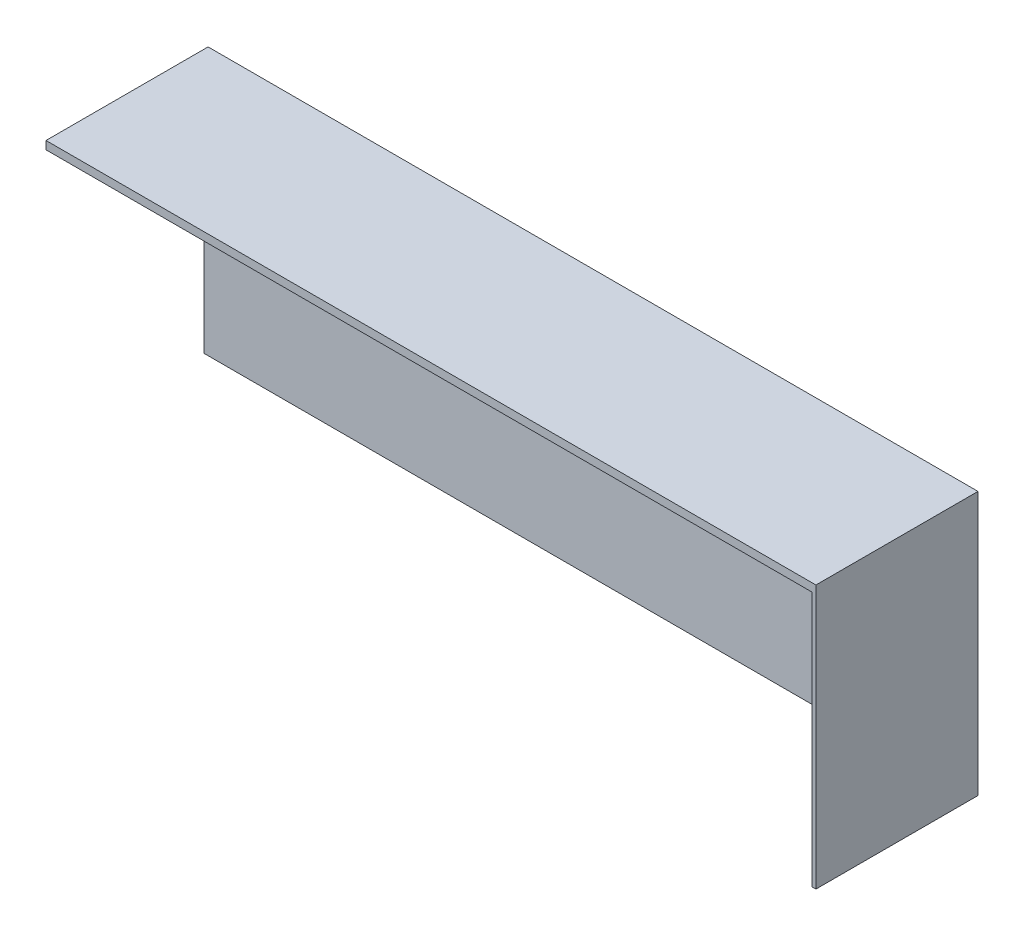
ISO-10303-21;
HEADER;
FILE_DESCRIPTION(('STEP AP214'),'2;1');
FILE_NAME('part.step','',(''),(''),'','','');
FILE_SCHEMA(('AUTOMOTIVE_DESIGN { 1 0 10303 214 1 1 1 1 }'));
ENDSEC;
DATA;
#1=APPLICATION_CONTEXT('core data for automotive mechanical design processes');
#2=APPLICATION_PROTOCOL_DEFINITION('international standard','automotive_design',2000,#1);
#3=PRODUCT_CONTEXT('',#1,'mechanical');
#4=PRODUCT('Part','Part','',(#3));
#5=PRODUCT_RELATED_PRODUCT_CATEGORY('part','',(#4));
#6=PRODUCT_DEFINITION_FORMATION('','',#4);
#7=PRODUCT_DEFINITION_CONTEXT('part definition',#1,'design');
#8=PRODUCT_DEFINITION('design','',#6,#7);
#9=PRODUCT_DEFINITION_SHAPE('','',#8);
#10=(LENGTH_UNIT() NAMED_UNIT(*) SI_UNIT(.MILLI.,.METRE.));
#11=(NAMED_UNIT(*) PLANE_ANGLE_UNIT() SI_UNIT($,.RADIAN.));
#12=(NAMED_UNIT(*) SI_UNIT($,.STERADIAN.) SOLID_ANGLE_UNIT());
#13=UNCERTAINTY_MEASURE_WITH_UNIT(LENGTH_MEASURE(1.E-05),#10,'distance_accuracy_value','');
#14=(GEOMETRIC_REPRESENTATION_CONTEXT(3) GLOBAL_UNCERTAINTY_ASSIGNED_CONTEXT((#13)) GLOBAL_UNIT_ASSIGNED_CONTEXT((#10,
#11,#12)) REPRESENTATION_CONTEXT('',''));
#15=CARTESIAN_POINT('',(0.,0.,0.));
#16=DIRECTION('',(0.,0.,1.));
#17=DIRECTION('',(1.,0.,0.));
#18=AXIS2_PLACEMENT_3D('',#15,#16,#17);
#19=CARTESIAN_POINT('',(-1900.,2591.64878389476,0.));
#20=DIRECTION('',(1.,0.,0.));
#21=DIRECTION('',(0.,0.,-1.));
#22=AXIS2_PLACEMENT_3D('',#19,#20,#21);
#23=PLANE('',#22);
#24=DIRECTION('',(0.,-1.,0.));
#25=VECTOR('',#24,1.);
#26=CARTESIAN_POINT('',(-1900.,2591.64878389476,10.));
#27=LINE('',#26,#25);
#28=CARTESIAN_POINT('',(-1900.,630.,10.));
#29=VERTEX_POINT('',#28);
#30=CARTESIAN_POINT('',(-1900.,0.,10.));
#31=VERTEX_POINT('',#30);
#32=EDGE_CURVE('E77',#29,#31,#27,.T.);
#33=ORIENTED_EDGE('',*,*,#32,.F.);
#34=DIRECTION('',(0.,0.,1.));
#35=VECTOR('',#34,1.);
#36=CARTESIAN_POINT('',(-1900.,630.,0.));
#37=LINE('',#36,#35);
#38=CARTESIAN_POINT('',(-1900.,630.,400.));
#39=VERTEX_POINT('',#38);
#40=EDGE_CURVE('E147',#29,#39,#37,.T.);
#41=ORIENTED_EDGE('',*,*,#40,.T.);
#42=DIRECTION('',(0.,1.,0.));
#43=VECTOR('',#42,1.);
#44=CARTESIAN_POINT('',(-1900.,630.,400.));
#45=LINE('',#44,#43);
#46=CARTESIAN_POINT('',(-1900.,650.,400.));
#47=VERTEX_POINT('',#46);
#48=EDGE_CURVE('E140',#39,#47,#45,.T.);
#49=ORIENTED_EDGE('',*,*,#48,.T.);
#50=DIRECTION('',(0.,0.,1.));
#51=VECTOR('',#50,1.);
#52=CARTESIAN_POINT('',(-1900.,650.,0.));
#53=LINE('',#52,#51);
#54=CARTESIAN_POINT('',(-1900.,650.,0.));
#55=VERTEX_POINT('',#54);
#56=EDGE_CURVE('E113',#55,#47,#53,.T.);
#57=ORIENTED_EDGE('',*,*,#56,.F.);
#58=DIRECTION('',(0.,-1.,0.));
#59=VECTOR('',#58,1.);
#60=CARTESIAN_POINT('',(-1900.,2591.64878389476,0.));
#61=LINE('',#60,#59);
#62=CARTESIAN_POINT('',(-1900.,0.,0.));
#63=VERTEX_POINT('',#62);
#64=EDGE_CURVE('E37',#55,#63,#61,.T.);
#65=ORIENTED_EDGE('',*,*,#64,.T.);
#66=DIRECTION('',(0.,0.,1.));
#67=VECTOR('',#66,1.);
#68=CARTESIAN_POINT('',(-1900.,0.,0.));
#69=LINE('',#68,#67);
#70=EDGE_CURVE('E124',#63,#31,#69,.T.);
#71=ORIENTED_EDGE('',*,*,#70,.T.);
#72=EDGE_LOOP('',(#33,#41,#49,#57,#65,#71));
#73=FACE_BOUND('',#72,.T.);
#74=ADVANCED_FACE('F33',(#73),#23,.F.);
#75=CARTESIAN_POINT('',(-1900.,2591.64878389476,10.));
#76=DIRECTION('',(0.,0.,-1.));
#77=DIRECTION('',(-1.,0.,0.));
#78=AXIS2_PLACEMENT_3D('',#75,#76,#77);
#79=PLANE('',#78);
#80=DIRECTION('',(0.,-1.,0.));
#81=VECTOR('',#80,1.);
#82=CARTESIAN_POINT('',(-10.,2591.64878389476,10.));
#83=LINE('',#82,#81);
#84=CARTESIAN_POINT('',(-10.,630.,10.));
#85=VERTEX_POINT('',#84);
#86=CARTESIAN_POINT('',(-10.,0.,10.));
#87=VERTEX_POINT('',#86);
#88=EDGE_CURVE('E125',#85,#87,#83,.T.);
#89=ORIENTED_EDGE('',*,*,#88,.F.);
#90=DIRECTION('',(-1.,0.,0.));
#91=VECTOR('',#90,1.);
#92=CARTESIAN_POINT('',(-1900.,630.,10.));
#93=LINE('',#92,#91);
#94=EDGE_CURVE('E88',#85,#29,#93,.T.);
#95=ORIENTED_EDGE('',*,*,#94,.T.);
#96=ORIENTED_EDGE('',*,*,#32,.T.);
#97=DIRECTION('',(1.,0.,0.));
#98=VECTOR('',#97,1.);
#99=CARTESIAN_POINT('',(-1900.,0.,10.));
#100=LINE('',#99,#98);
#101=EDGE_CURVE('E123',#31,#87,#100,.T.);
#102=ORIENTED_EDGE('',*,*,#101,.T.);
#103=EDGE_LOOP('',(#89,#95,#96,#102));
#104=FACE_BOUND('',#103,.T.);
#105=ADVANCED_FACE('F156',(#104),#79,.F.);
#106=CARTESIAN_POINT('',(-10.,2591.64878389476,10.));
#107=DIRECTION('',(1.,0.,0.));
#108=DIRECTION('',(0.,0.,-1.));
#109=AXIS2_PLACEMENT_3D('',#106,#107,#108);
#110=PLANE('',#109);
#111=DIRECTION('',(0.,-1.,0.));
#112=VECTOR('',#111,1.);
#113=CARTESIAN_POINT('',(-9.99999999999995,2591.64878389476,400.));
#114=LINE('',#113,#112);
#115=CARTESIAN_POINT('',(-9.99999999999995,630.,400.));
#116=VERTEX_POINT('',#115);
#117=CARTESIAN_POINT('',(-9.99999999999995,0.,400.));
#118=VERTEX_POINT('',#117);
#119=EDGE_CURVE('E128',#116,#118,#114,.T.);
#120=ORIENTED_EDGE('',*,*,#119,.F.);
#121=DIRECTION('',(0.,0.,-1.));
#122=VECTOR('',#121,1.);
#123=CARTESIAN_POINT('',(-10.,630.,10.));
#124=LINE('',#123,#122);
#125=EDGE_CURVE('E138',#116,#85,#124,.T.);
#126=ORIENTED_EDGE('',*,*,#125,.T.);
#127=ORIENTED_EDGE('',*,*,#88,.T.);
#128=DIRECTION('',(0.,0.,1.));
#129=VECTOR('',#128,1.);
#130=CARTESIAN_POINT('',(-10.,0.,10.));
#131=LINE('',#130,#129);
#132=EDGE_CURVE('E127',#87,#118,#131,.T.);
#133=ORIENTED_EDGE('',*,*,#132,.T.);
#134=EDGE_LOOP('',(#120,#126,#127,#133));
#135=FACE_BOUND('',#134,.T.);
#136=ADVANCED_FACE('F155',(#135),#110,.F.);
#137=CARTESIAN_POINT('',(-9.99999999999995,2591.64878389476,400.));
#138=DIRECTION('',(0.,0.,-1.));
#139=DIRECTION('',(-1.,0.,0.));
#140=AXIS2_PLACEMENT_3D('',#137,#138,#139);
#141=PLANE('',#140);
#142=DIRECTION('',(1.,0.,0.));
#143=VECTOR('',#142,1.);
#144=CARTESIAN_POINT('',(-9.99999999999995,0.,400.));
#145=LINE('',#144,#143);
#146=CARTESIAN_POINT('',(0.,0.,400.));
#147=VERTEX_POINT('',#146);
#148=EDGE_CURVE('E109',#118,#147,#145,.T.);
#149=ORIENTED_EDGE('',*,*,#148,.T.);
#150=DIRECTION('',(0.,-1.,0.));
#151=VECTOR('',#150,1.);
#152=CARTESIAN_POINT('',(0.,2591.64878389476,400.));
#153=LINE('',#152,#151);
#154=CARTESIAN_POINT('',(0.,650.,400.));
#155=VERTEX_POINT('',#154);
#156=EDGE_CURVE('E97',#155,#147,#153,.T.);
#157=ORIENTED_EDGE('',*,*,#156,.F.);
#158=DIRECTION('',(1.,0.,0.));
#159=VECTOR('',#158,1.);
#160=CARTESIAN_POINT('',(-9.99999999999995,650.,400.));
#161=LINE('',#160,#159);
#162=EDGE_CURVE('E42',#47,#155,#161,.T.);
#163=ORIENTED_EDGE('',*,*,#162,.F.);
#164=ORIENTED_EDGE('',*,*,#48,.F.);
#165=DIRECTION('',(1.,0.,0.));
#166=VECTOR('',#165,1.);
#167=CARTESIAN_POINT('',(0.,630.,400.));
#168=LINE('',#167,#166);
#169=EDGE_CURVE('E144',#39,#116,#168,.T.);
#170=ORIENTED_EDGE('',*,*,#169,.T.);
#171=ORIENTED_EDGE('',*,*,#119,.T.);
#172=EDGE_LOOP('',(#149,#157,#163,#164,#170,#171));
#173=FACE_BOUND('',#172,.T.);
#174=ADVANCED_FACE('F104',(#173),#141,.F.);
#175=CARTESIAN_POINT('',(0.,2591.64878389476,0.));
#176=DIRECTION('',(-1.,0.,0.));
#177=DIRECTION('',(0.,0.,1.));
#178=AXIS2_PLACEMENT_3D('',#175,#176,#177);
#179=PLANE('',#178);
#180=DIRECTION('',(0.,0.,-1.));
#181=VECTOR('',#180,1.);
#182=CARTESIAN_POINT('',(0.,0.,0.));
#183=LINE('',#182,#181);
#184=CARTESIAN_POINT('',(0.,0.,0.));
#185=VERTEX_POINT('',#184);
#186=EDGE_CURVE('E111',#147,#185,#183,.T.);
#187=ORIENTED_EDGE('',*,*,#186,.T.);
#188=DIRECTION('',(0.,-1.,0.));
#189=VECTOR('',#188,1.);
#190=CARTESIAN_POINT('',(0.,2591.64878389476,0.));
#191=LINE('',#190,#189);
#192=CARTESIAN_POINT('',(0.,650.,0.));
#193=VERTEX_POINT('',#192);
#194=EDGE_CURVE('E55',#193,#185,#191,.T.);
#195=ORIENTED_EDGE('',*,*,#194,.F.);
#196=DIRECTION('',(0.,0.,-1.));
#197=VECTOR('',#196,1.);
#198=CARTESIAN_POINT('',(0.,650.,0.));
#199=LINE('',#198,#197);
#200=EDGE_CURVE('E11',#155,#193,#199,.T.);
#201=ORIENTED_EDGE('',*,*,#200,.F.);
#202=ORIENTED_EDGE('',*,*,#156,.T.);
#203=EDGE_LOOP('',(#187,#195,#201,#202));
#204=FACE_BOUND('',#203,.T.);
#205=ADVANCED_FACE('F96',(#204),#179,.F.);
#206=CARTESIAN_POINT('',(-1900.,2591.64878389476,0.));
#207=DIRECTION('',(0.,0.,1.));
#208=DIRECTION('',(1.,0.,0.));
#209=AXIS2_PLACEMENT_3D('',#206,#207,#208);
#210=PLANE('',#209);
#211=DIRECTION('',(-1.,0.,0.));
#212=VECTOR('',#211,1.);
#213=CARTESIAN_POINT('',(-1900.,0.,0.));
#214=LINE('',#213,#212);
#215=EDGE_CURVE('E121',#185,#63,#214,.T.);
#216=ORIENTED_EDGE('',*,*,#215,.T.);
#217=ORIENTED_EDGE('',*,*,#64,.F.);
#218=DIRECTION('',(-1.,0.,0.));
#219=VECTOR('',#218,1.);
#220=CARTESIAN_POINT('',(-1900.,650.,0.));
#221=LINE('',#220,#219);
#222=EDGE_CURVE('E116',#193,#55,#221,.T.);
#223=ORIENTED_EDGE('',*,*,#222,.F.);
#224=ORIENTED_EDGE('',*,*,#194,.T.);
#225=EDGE_LOOP('',(#216,#217,#223,#224));
#226=FACE_BOUND('',#225,.T.);
#227=ADVANCED_FACE('F160',(#226),#210,.F.);
#228=CARTESIAN_POINT('',(0.,0.,0.));
#229=DIRECTION('',(0.,1.,0.));
#230=DIRECTION('',(0.,0.,1.));
#231=AXIS2_PLACEMENT_3D('',#228,#229,#230);
#232=PLANE('',#231);
#233=ORIENTED_EDGE('',*,*,#70,.F.);
#234=ORIENTED_EDGE('',*,*,#215,.F.);
#235=ORIENTED_EDGE('',*,*,#186,.F.);
#236=ORIENTED_EDGE('',*,*,#148,.F.);
#237=ORIENTED_EDGE('',*,*,#132,.F.);
#238=ORIENTED_EDGE('',*,*,#101,.F.);
#239=EDGE_LOOP('',(#233,#234,#235,#236,#237,#238));
#240=FACE_BOUND('',#239,.T.);
#241=ADVANCED_FACE('F159',(#240),#232,.F.);
#242=CARTESIAN_POINT('',(-2100.,650.,400.));
#243=DIRECTION('',(0.,1.,0.));
#244=DIRECTION('',(0.,0.,1.));
#245=AXIS2_PLACEMENT_3D('',#242,#243,#244);
#246=PLANE('',#245);
#247=ORIENTED_EDGE('',*,*,#222,.T.);
#248=ORIENTED_EDGE('',*,*,#56,.T.);
#249=ORIENTED_EDGE('',*,*,#162,.T.);
#250=ORIENTED_EDGE('',*,*,#200,.T.);
#251=EDGE_LOOP('',(#247,#248,#249,#250));
#252=FACE_BOUND('',#251,.T.);
#253=ADVANCED_FACE('F35',(#252),#246,.T.);
#254=CARTESIAN_POINT('',(0.,630.,0.));
#255=DIRECTION('',(0.,-1.,0.));
#256=DIRECTION('',(0.,0.,-1.));
#257=AXIS2_PLACEMENT_3D('',#254,#255,#256);
#258=PLANE('',#257);
#259=ORIENTED_EDGE('',*,*,#94,.F.);
#260=ORIENTED_EDGE('',*,*,#125,.F.);
#261=ORIENTED_EDGE('',*,*,#169,.F.);
#262=ORIENTED_EDGE('',*,*,#40,.F.);
#263=EDGE_LOOP('',(#259,#260,#261,#262));
#264=FACE_BOUND('',#263,.T.);
#265=ADVANCED_FACE('F153',(#264),#258,.T.);
#266=CLOSED_SHELL('',(#74,#105,#136,#174,#205,#227,#241,#253,#265));
#267=MANIFOLD_SOLID_BREP('B2',#266);
#268=ADVANCED_BREP_SHAPE_REPRESENTATION('',(#18,#267),#14);
#269=SHAPE_DEFINITION_REPRESENTATION(#9,#268);
ENDSEC;
END-ISO-10303-21;
